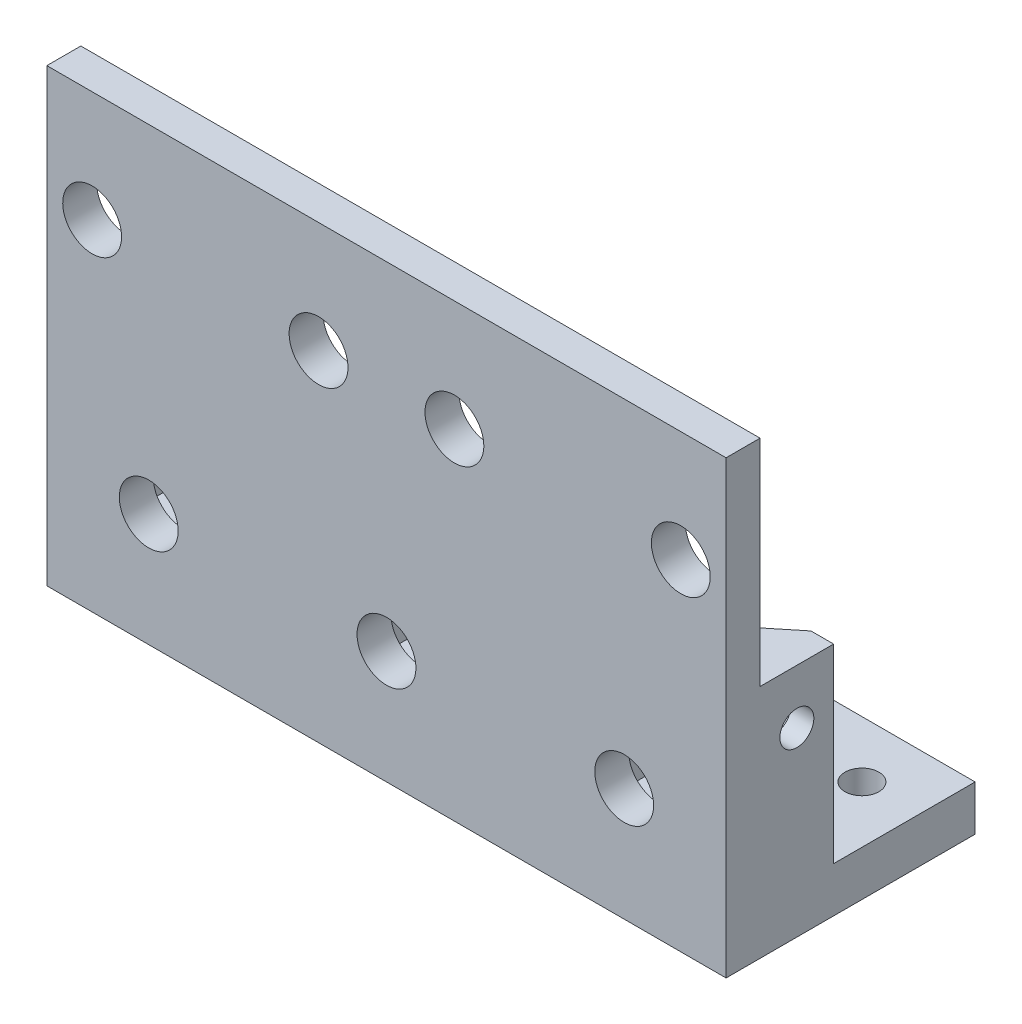
ISO-10303-21;
HEADER;
FILE_DESCRIPTION(('STEP AP214'),'2;1');
FILE_NAME('part.step','',(''),(''),'','','');
FILE_SCHEMA(('AUTOMOTIVE_DESIGN { 1 0 10303 214 1 1 1 1 }'));
ENDSEC;
DATA;
#1=APPLICATION_CONTEXT('core data for automotive mechanical design processes');
#2=APPLICATION_PROTOCOL_DEFINITION('international standard','automotive_design',2000,#1);
#3=PRODUCT_CONTEXT('',#1,'mechanical');
#4=PRODUCT('Part','Part','',(#3));
#5=PRODUCT_RELATED_PRODUCT_CATEGORY('part','',(#4));
#6=PRODUCT_DEFINITION_FORMATION('','',#4);
#7=PRODUCT_DEFINITION_CONTEXT('part definition',#1,'design');
#8=PRODUCT_DEFINITION('design','',#6,#7);
#9=PRODUCT_DEFINITION_SHAPE('','',#8);
#10=(LENGTH_UNIT() NAMED_UNIT(*) SI_UNIT(.MILLI.,.METRE.));
#11=(NAMED_UNIT(*) PLANE_ANGLE_UNIT() SI_UNIT($,.RADIAN.));
#12=(NAMED_UNIT(*) SI_UNIT($,.STERADIAN.) SOLID_ANGLE_UNIT());
#13=UNCERTAINTY_MEASURE_WITH_UNIT(LENGTH_MEASURE(1.E-05),#10,'distance_accuracy_value','');
#14=(GEOMETRIC_REPRESENTATION_CONTEXT(3) GLOBAL_UNCERTAINTY_ASSIGNED_CONTEXT((#13)) GLOBAL_UNIT_ASSIGNED_CONTEXT((#10,
#11,#12)) REPRESENTATION_CONTEXT('',''));
#15=CARTESIAN_POINT('',(0.,0.,0.));
#16=DIRECTION('',(0.,0.,1.));
#17=DIRECTION('',(1.,0.,0.));
#18=AXIS2_PLACEMENT_3D('',#15,#16,#17);
#19=CARTESIAN_POINT('',(60.,19.9,-1.5));
#20=DIRECTION('',(0.,0.,1.));
#21=DIRECTION('',(0.,-1.,0.));
#22=AXIS2_PLACEMENT_3D('',#19,#20,#21);
#23=PLANE('',#22);
#24=CARTESIAN_POINT('',(9.,-9.89999999999999,-1.5));
#25=DIRECTION('',(0.,0.,-1.));
#26=DIRECTION('',(0.,1.,0.));
#27=AXIS2_PLACEMENT_3D('',#24,#25,#26);
#28=CIRCLE('',#27,2.60000000000001);
#29=CARTESIAN_POINT('',(9.,-7.29999999999998,-1.5));
#30=VERTEX_POINT('',#29);
#31=EDGE_CURVE('E335',#30,#30,#28,.T.);
#32=ORIENTED_EDGE('',*,*,#31,.F.);
#33=EDGE_LOOP('',(#32));
#34=FACE_BOUND('',#33,.T.);
#35=CARTESIAN_POINT('',(30.,-9.89999999999999,-1.5));
#36=DIRECTION('',(0.,0.,-1.));
#37=DIRECTION('',(0.,1.,0.));
#38=AXIS2_PLACEMENT_3D('',#35,#36,#37);
#39=CIRCLE('',#38,2.60000000000001);
#40=CARTESIAN_POINT('',(30.,-7.29999999999998,-1.5));
#41=VERTEX_POINT('',#40);
#42=EDGE_CURVE('E329',#41,#41,#39,.T.);
#43=ORIENTED_EDGE('',*,*,#42,.F.);
#44=EDGE_LOOP('',(#43));
#45=FACE_BOUND('',#44,.T.);
#46=CARTESIAN_POINT('',(51.,-9.89999999999999,-1.5));
#47=DIRECTION('',(0.,0.,-1.));
#48=DIRECTION('',(0.,1.,0.));
#49=AXIS2_PLACEMENT_3D('',#46,#47,#48);
#50=CIRCLE('',#49,2.60000000000001);
#51=CARTESIAN_POINT('',(51.,-7.29999999999998,-1.5));
#52=VERTEX_POINT('',#51);
#53=EDGE_CURVE('E323',#52,#52,#50,.T.);
#54=ORIENTED_EDGE('',*,*,#53,.F.);
#55=EDGE_LOOP('',(#54));
#56=FACE_BOUND('',#55,.T.);
#57=CARTESIAN_POINT('',(4.,10.1,-1.5));
#58=DIRECTION('',(0.,0.,-1.));
#59=DIRECTION('',(0.,1.,0.));
#60=AXIS2_PLACEMENT_3D('',#57,#58,#59);
#61=CIRCLE('',#60,2.60000000000001);
#62=CARTESIAN_POINT('',(4.,12.7,-1.5));
#63=VERTEX_POINT('',#62);
#64=EDGE_CURVE('E255',#63,#63,#61,.T.);
#65=ORIENTED_EDGE('',*,*,#64,.F.);
#66=EDGE_LOOP('',(#65));
#67=FACE_BOUND('',#66,.T.);
#68=CARTESIAN_POINT('',(24.,10.1,-1.5));
#69=DIRECTION('',(0.,0.,-1.));
#70=DIRECTION('',(0.,1.,0.));
#71=AXIS2_PLACEMENT_3D('',#68,#69,#70);
#72=CIRCLE('',#71,2.60000000000001);
#73=CARTESIAN_POINT('',(24.,12.7,-1.5));
#74=VERTEX_POINT('',#73);
#75=EDGE_CURVE('E249',#74,#74,#72,.T.);
#76=ORIENTED_EDGE('',*,*,#75,.F.);
#77=EDGE_LOOP('',(#76));
#78=FACE_BOUND('',#77,.T.);
#79=CARTESIAN_POINT('',(36.,10.1,-1.5));
#80=DIRECTION('',(0.,0.,-1.));
#81=DIRECTION('',(0.,1.,0.));
#82=AXIS2_PLACEMENT_3D('',#79,#80,#81);
#83=CIRCLE('',#82,2.60000000000001);
#84=CARTESIAN_POINT('',(36.,12.7,-1.5));
#85=VERTEX_POINT('',#84);
#86=EDGE_CURVE('E243',#85,#85,#83,.T.);
#87=ORIENTED_EDGE('',*,*,#86,.F.);
#88=EDGE_LOOP('',(#87));
#89=FACE_BOUND('',#88,.T.);
#90=CARTESIAN_POINT('',(56.,10.1,-1.5));
#91=DIRECTION('',(0.,0.,-1.));
#92=DIRECTION('',(0.,1.,0.));
#93=AXIS2_PLACEMENT_3D('',#90,#91,#92);
#94=CIRCLE('',#93,2.60000000000001);
#95=CARTESIAN_POINT('',(56.,12.7,-1.5));
#96=VERTEX_POINT('',#95);
#97=EDGE_CURVE('E237',#96,#96,#94,.T.);
#98=ORIENTED_EDGE('',*,*,#97,.F.);
#99=EDGE_LOOP('',(#98));
#100=FACE_BOUND('',#99,.T.);
#101=DIRECTION('',(0.,1.,0.));
#102=VECTOR('',#101,1.);
#103=CARTESIAN_POINT('',(60.,19.9,-1.5));
#104=LINE('',#103,#102);
#105=CARTESIAN_POINT('',(60.,0.900000000000005,-1.5));
#106=VERTEX_POINT('',#105);
#107=CARTESIAN_POINT('',(60.,19.9,-1.5));
#108=VERTEX_POINT('',#107);
#109=EDGE_CURVE('E397',#106,#108,#104,.T.);
#110=ORIENTED_EDGE('',*,*,#109,.F.);
#111=DIRECTION('',(-1.,0.,0.));
#112=VECTOR('',#111,1.);
#113=CARTESIAN_POINT('',(50.,0.900000000000005,-1.49999999999999));
#114=LINE('',#113,#112);
#115=CARTESIAN_POINT('',(50.,0.900000000000005,-1.49999999999999));
#116=VERTEX_POINT('',#115);
#117=EDGE_CURVE('E202',#106,#116,#114,.T.);
#118=ORIENTED_EDGE('',*,*,#117,.T.);
#119=DIRECTION('',(0.,-1.,0.));
#120=VECTOR('',#119,1.);
#121=CARTESIAN_POINT('',(50.,0.900000000000005,-1.49999999999999));
#122=LINE('',#121,#120);
#123=CARTESIAN_POINT('',(50.,-0.899999999999995,-1.49999999999999));
#124=VERTEX_POINT('',#123);
#125=EDGE_CURVE('E213',#116,#124,#122,.T.);
#126=ORIENTED_EDGE('',*,*,#125,.T.);
#127=DIRECTION('',(-1.,0.,0.));
#128=VECTOR('',#127,1.);
#129=CARTESIAN_POINT('',(60.,-0.899999999999995,-1.5));
#130=LINE('',#129,#128);
#131=CARTESIAN_POINT('',(58.,-0.899999999999995,-1.5));
#132=VERTEX_POINT('',#131);
#133=EDGE_CURVE('E203',#132,#124,#130,.T.);
#134=ORIENTED_EDGE('',*,*,#133,.F.);
#135=DIRECTION('',(0.,1.,0.));
#136=VECTOR('',#135,1.);
#137=CARTESIAN_POINT('',(58.,-0.899999999999994,-1.5));
#138=LINE('',#137,#136);
#139=CARTESIAN_POINT('',(58.,-15.9,-1.5));
#140=VERTEX_POINT('',#139);
#141=EDGE_CURVE('E54',#140,#132,#138,.T.);
#142=ORIENTED_EDGE('',*,*,#141,.F.);
#143=DIRECTION('',(-1.,0.,0.));
#144=VECTOR('',#143,1.);
#145=CARTESIAN_POINT('',(60.,-15.9,-1.5));
#146=LINE('',#145,#144);
#147=CARTESIAN_POINT('',(45.,-15.9,-1.5));
#148=VERTEX_POINT('',#147);
#149=EDGE_CURVE('E343',#140,#148,#146,.T.);
#150=ORIENTED_EDGE('',*,*,#149,.T.);
#151=DIRECTION('',(0.,-1.,0.));
#152=VECTOR('',#151,1.);
#153=CARTESIAN_POINT('',(45.,44.1,-1.5));
#154=LINE('',#153,#152);
#155=CARTESIAN_POINT('',(45.,-0.100000000000003,-1.5));
#156=VERTEX_POINT('',#155);
#157=EDGE_CURVE('E348',#156,#148,#154,.T.);
#158=ORIENTED_EDGE('',*,*,#157,.F.);
#159=DIRECTION('',(-1.,0.,0.));
#160=VECTOR('',#159,1.);
#161=CARTESIAN_POINT('',(60.,-0.100000000000003,-1.5));
#162=LINE('',#161,#160);
#163=CARTESIAN_POINT('',(36.,-0.100000000000003,-1.5));
#164=VERTEX_POINT('',#163);
#165=EDGE_CURVE('E424',#156,#164,#162,.T.);
#166=ORIENTED_EDGE('',*,*,#165,.T.);
#167=DIRECTION('',(0.,-1.,0.));
#168=VECTOR('',#167,1.);
#169=CARTESIAN_POINT('',(36.,44.1,-1.5));
#170=LINE('',#169,#168);
#171=CARTESIAN_POINT('',(36.,-15.9,-1.5));
#172=VERTEX_POINT('',#171);
#173=EDGE_CURVE('E365',#164,#172,#170,.T.);
#174=ORIENTED_EDGE('',*,*,#173,.T.);
#175=DIRECTION('',(-1.,0.,0.));
#176=VECTOR('',#175,1.);
#177=CARTESIAN_POINT('',(36.,-15.9,-1.5));
#178=LINE('',#177,#176);
#179=CARTESIAN_POINT('',(24.,-15.9,-1.5));
#180=VERTEX_POINT('',#179);
#181=EDGE_CURVE('E367',#172,#180,#178,.T.);
#182=ORIENTED_EDGE('',*,*,#181,.T.);
#183=DIRECTION('',(0.,-1.,0.));
#184=VECTOR('',#183,1.);
#185=CARTESIAN_POINT('',(24.,44.1,-1.5));
#186=LINE('',#185,#184);
#187=CARTESIAN_POINT('',(24.,-0.100000000000003,-1.5));
#188=VERTEX_POINT('',#187);
#189=EDGE_CURVE('E341',#188,#180,#186,.T.);
#190=ORIENTED_EDGE('',*,*,#189,.F.);
#191=CARTESIAN_POINT('',(15.,-0.100000000000003,-1.5));
#192=VERTEX_POINT('',#191);
#193=EDGE_CURVE('E422',#188,#192,#162,.T.);
#194=ORIENTED_EDGE('',*,*,#193,.T.);
#195=DIRECTION('',(0.,-1.,0.));
#196=VECTOR('',#195,1.);
#197=CARTESIAN_POINT('',(15.,44.1,-1.5));
#198=LINE('',#197,#196);
#199=CARTESIAN_POINT('',(15.,-15.9,-1.5));
#200=VERTEX_POINT('',#199);
#201=EDGE_CURVE('E352',#192,#200,#198,.T.);
#202=ORIENTED_EDGE('',*,*,#201,.T.);
#203=DIRECTION('',(-1.,0.,0.));
#204=VECTOR('',#203,1.);
#205=CARTESIAN_POINT('',(0.,-15.9,-1.5));
#206=LINE('',#205,#204);
#207=CARTESIAN_POINT('',(2.,-15.9,-1.5));
#208=VERTEX_POINT('',#207);
#209=EDGE_CURVE('E354',#200,#208,#206,.T.);
#210=ORIENTED_EDGE('',*,*,#209,.T.);
#211=DIRECTION('',(0.,1.,0.));
#212=VECTOR('',#211,1.);
#213=CARTESIAN_POINT('',(2.,-0.899999999999994,-1.5));
#214=LINE('',#213,#212);
#215=CARTESIAN_POINT('',(2.,-0.899999999999994,-1.5));
#216=VERTEX_POINT('',#215);
#217=EDGE_CURVE('E290',#208,#216,#214,.T.);
#218=ORIENTED_EDGE('',*,*,#217,.T.);
#219=DIRECTION('',(1.,0.,0.));
#220=VECTOR('',#219,1.);
#221=CARTESIAN_POINT('',(10.,-0.899999999999995,-1.49999999999999));
#222=LINE('',#221,#220);
#223=CARTESIAN_POINT('',(9.99999999999998,-0.899999999999995,-1.5));
#224=VERTEX_POINT('',#223);
#225=EDGE_CURVE('E261',#216,#224,#222,.T.);
#226=ORIENTED_EDGE('',*,*,#225,.T.);
#227=DIRECTION('',(0.,-1.,0.));
#228=VECTOR('',#227,1.);
#229=CARTESIAN_POINT('',(10.,0.900000000000005,-1.49999999999999));
#230=LINE('',#229,#228);
#231=CARTESIAN_POINT('',(9.99999999999998,0.900000000000005,-1.5));
#232=VERTEX_POINT('',#231);
#233=EDGE_CURVE('E280',#232,#224,#230,.T.);
#234=ORIENTED_EDGE('',*,*,#233,.F.);
#235=DIRECTION('',(1.,0.,0.));
#236=VECTOR('',#235,1.);
#237=CARTESIAN_POINT('',(0.,0.900000000000005,-1.5));
#238=LINE('',#237,#236);
#239=CARTESIAN_POINT('',(0.,0.900000000000005,-1.5));
#240=VERTEX_POINT('',#239);
#241=EDGE_CURVE('E265',#240,#232,#238,.T.);
#242=ORIENTED_EDGE('',*,*,#241,.F.);
#243=DIRECTION('',(0.,1.,0.));
#244=VECTOR('',#243,1.);
#245=CARTESIAN_POINT('',(0.,19.9,-1.5));
#246=LINE('',#245,#244);
#247=CARTESIAN_POINT('',(0.,19.9,-1.5));
#248=VERTEX_POINT('',#247);
#249=EDGE_CURVE('E407',#240,#248,#246,.T.);
#250=ORIENTED_EDGE('',*,*,#249,.T.);
#251=DIRECTION('',(-1.,0.,0.));
#252=VECTOR('',#251,1.);
#253=CARTESIAN_POINT('',(60.,19.9,-1.5));
#254=LINE('',#253,#252);
#255=EDGE_CURVE('E419',#108,#248,#254,.T.);
#256=ORIENTED_EDGE('',*,*,#255,.F.);
#257=EDGE_LOOP('',(#110,#118,#126,#134,#142,#150,#158,#166,#174,#182,#190,#194,#202,#210,#218,
#226,#234,#242,#250,#256));
#258=FACE_BOUND('',#257,.T.);
#259=ADVANCED_FACE('F39',(#34,#45,#56,#67,#78,#89,#100,#258),#23,.F.);
#260=CARTESIAN_POINT('',(0.,-15.9,0.));
#261=DIRECTION('',(0.,-1.,0.));
#262=DIRECTION('',(0.,0.,-1.));
#263=AXIS2_PLACEMENT_3D('',#260,#261,#262);
#264=PLANE('',#263);
#265=CARTESIAN_POINT('',(55.,-15.9,-15.5));
#266=DIRECTION('',(0.,-1.,0.));
#267=DIRECTION('',(0.,0.,-1.));
#268=AXIS2_PLACEMENT_3D('',#265,#266,#267);
#269=CIRCLE('',#268,1.50000000000001);
#270=CARTESIAN_POINT('',(55.,-15.9,-17.));
#271=VERTEX_POINT('',#270);
#272=EDGE_CURVE('E308',#271,#271,#269,.T.);
#273=ORIENTED_EDGE('',*,*,#272,.T.);
#274=EDGE_LOOP('',(#273));
#275=FACE_BOUND('',#274,.T.);
#276=DIRECTION('',(0.,0.,1.));
#277=VECTOR('',#276,1.);
#278=CARTESIAN_POINT('',(58.,-15.9,-8.));
#279=LINE('',#278,#277);
#280=CARTESIAN_POINT('',(58.,-15.9,-8.));
#281=VERTEX_POINT('',#280);
#282=EDGE_CURVE('E227',#281,#140,#279,.T.);
#283=ORIENTED_EDGE('',*,*,#282,.F.);
#284=DIRECTION('',(1.,0.,0.));
#285=VECTOR('',#284,1.);
#286=CARTESIAN_POINT('',(58.,-15.9,-8.));
#287=LINE('',#286,#285);
#288=CARTESIAN_POINT('',(60.,-15.9,-8.));
#289=VERTEX_POINT('',#288);
#290=EDGE_CURVE('E62',#281,#289,#287,.T.);
#291=ORIENTED_EDGE('',*,*,#290,.T.);
#292=DIRECTION('',(0.,0.,1.));
#293=VECTOR('',#292,1.);
#294=CARTESIAN_POINT('',(60.,-15.9,-20.5));
#295=LINE('',#294,#293);
#296=CARTESIAN_POINT('',(60.,-15.9,-20.5));
#297=VERTEX_POINT('',#296);
#298=EDGE_CURVE('E190',#297,#289,#295,.T.);
#299=ORIENTED_EDGE('',*,*,#298,.F.);
#300=DIRECTION('',(-1.,0.,0.));
#301=VECTOR('',#300,1.);
#302=CARTESIAN_POINT('',(60.,-15.9,-20.5));
#303=LINE('',#302,#301);
#304=CARTESIAN_POINT('',(45.,-15.9,-20.5));
#305=VERTEX_POINT('',#304);
#306=EDGE_CURVE('E47',#297,#305,#303,.T.);
#307=ORIENTED_EDGE('',*,*,#306,.T.);
#308=DIRECTION('',(0.,0.,-1.));
#309=VECTOR('',#308,1.);
#310=CARTESIAN_POINT('',(45.,-15.9,-20.5));
#311=LINE('',#310,#309);
#312=EDGE_CURVE('E346',#148,#305,#311,.T.);
#313=ORIENTED_EDGE('',*,*,#312,.F.);
#314=ORIENTED_EDGE('',*,*,#149,.F.);
#315=EDGE_LOOP('',(#283,#291,#299,#307,#313,#314));
#316=FACE_BOUND('',#315,.T.);
#317=ADVANCED_FACE('F501',(#275,#316),#264,.F.);
#318=CARTESIAN_POINT('',(60.,-15.9,-20.5));
#319=DIRECTION('',(0.,-0.768884270285603,0.639387972132238));
#320=DIRECTION('',(0.,-0.639387972132238,-0.768884270285603));
#321=AXIS2_PLACEMENT_3D('',#318,#319,#320);
#322=PLANE('',#321);
#323=CARTESIAN_POINT('',(24.,-15.9,-20.5));
#324=VERTEX_POINT('',#323);
#325=CARTESIAN_POINT('',(15.,-15.9,-20.5));
#326=VERTEX_POINT('',#325);
#327=EDGE_CURVE('E427',#324,#326,#303,.T.);
#328=ORIENTED_EDGE('',*,*,#327,.T.);
#329=DIRECTION('',(0.,0.639387972132238,0.768884270285603));
#330=VECTOR('',#329,1.);
#331=CARTESIAN_POINT('',(15.,-15.9,-20.5));
#332=LINE('',#331,#330);
#333=EDGE_CURVE('E384',#326,#192,#332,.T.);
#334=ORIENTED_EDGE('',*,*,#333,.T.);
#335=ORIENTED_EDGE('',*,*,#193,.F.);
#336=DIRECTION('',(0.,-0.639387972132238,-0.768884270285603));
#337=VECTOR('',#336,1.);
#338=CARTESIAN_POINT('',(24.,-15.9,-20.5));
#339=LINE('',#338,#337);
#340=EDGE_CURVE('E381',#188,#324,#339,.T.);
#341=ORIENTED_EDGE('',*,*,#340,.T.);
#342=EDGE_LOOP('',(#328,#334,#335,#341));
#343=FACE_BOUND('',#342,.T.);
#344=ADVANCED_FACE('F452',(#343),#322,.F.);
#345=CARTESIAN_POINT('',(60.,-19.9,-20.5));
#346=DIRECTION('',(0.,0.,1.));
#347=DIRECTION('',(1.,0.,0.));
#348=AXIS2_PLACEMENT_3D('',#345,#346,#347);
#349=PLANE('',#348);
#350=DIRECTION('',(0.,1.,0.));
#351=VECTOR('',#350,1.);
#352=CARTESIAN_POINT('',(0.,-19.9,-20.5));
#353=LINE('',#352,#351);
#354=CARTESIAN_POINT('',(0.,-19.9,-20.5));
#355=VERTEX_POINT('',#354);
#356=CARTESIAN_POINT('',(0.,-15.9,-20.5));
#357=VERTEX_POINT('',#356);
#358=EDGE_CURVE('E390',#355,#357,#353,.T.);
#359=ORIENTED_EDGE('',*,*,#358,.T.);
#360=DIRECTION('',(1.,0.,0.));
#361=VECTOR('',#360,1.);
#362=CARTESIAN_POINT('',(0.,-15.9,-20.5));
#363=LINE('',#362,#361);
#364=EDGE_CURVE('E361',#357,#326,#363,.T.);
#365=ORIENTED_EDGE('',*,*,#364,.T.);
#366=ORIENTED_EDGE('',*,*,#327,.F.);
#367=DIRECTION('',(1.,0.,0.));
#368=VECTOR('',#367,1.);
#369=CARTESIAN_POINT('',(36.,-15.9,-20.5));
#370=LINE('',#369,#368);
#371=CARTESIAN_POINT('',(36.,-15.9,-20.5));
#372=VERTEX_POINT('',#371);
#373=EDGE_CURVE('E374',#324,#372,#370,.T.);
#374=ORIENTED_EDGE('',*,*,#373,.T.);
#375=EDGE_CURVE('E426',#305,#372,#303,.T.);
#376=ORIENTED_EDGE('',*,*,#375,.F.);
#377=ORIENTED_EDGE('',*,*,#306,.F.);
#378=DIRECTION('',(0.,1.,0.));
#379=VECTOR('',#378,1.);
#380=CARTESIAN_POINT('',(60.,-19.9,-20.5));
#381=LINE('',#380,#379);
#382=CARTESIAN_POINT('',(60.,-19.9,-20.5));
#383=VERTEX_POINT('',#382);
#384=EDGE_CURVE('E394',#383,#297,#381,.T.);
#385=ORIENTED_EDGE('',*,*,#384,.F.);
#386=DIRECTION('',(-1.,0.,0.));
#387=VECTOR('',#386,1.);
#388=CARTESIAN_POINT('',(60.,-19.9,-20.5));
#389=LINE('',#388,#387);
#390=EDGE_CURVE('E11',#383,#355,#389,.T.);
#391=ORIENTED_EDGE('',*,*,#390,.T.);
#392=EDGE_LOOP('',(#359,#365,#366,#374,#376,#377,#385,#391));
#393=FACE_BOUND('',#392,.T.);
#394=ADVANCED_FACE('F41',(#393),#349,.F.);
#395=ORIENTED_EDGE('',*,*,#165,.F.);
#396=DIRECTION('',(0.,-0.639387972132238,-0.768884270285603));
#397=VECTOR('',#396,1.);
#398=CARTESIAN_POINT('',(45.,-15.9,-20.5));
#399=LINE('',#398,#397);
#400=EDGE_CURVE('E387',#156,#305,#399,.T.);
#401=ORIENTED_EDGE('',*,*,#400,.T.);
#402=ORIENTED_EDGE('',*,*,#375,.T.);
#403=DIRECTION('',(0.,0.639387972132238,0.768884270285603));
#404=VECTOR('',#403,1.);
#405=CARTESIAN_POINT('',(36.,-15.9,-20.5));
#406=LINE('',#405,#404);
#407=EDGE_CURVE('E351',#372,#164,#406,.T.);
#408=ORIENTED_EDGE('',*,*,#407,.T.);
#409=EDGE_LOOP('',(#395,#401,#402,#408));
#410=FACE_BOUND('',#409,.T.);
#411=ADVANCED_FACE('F438',(#410),#322,.F.);
#412=CARTESIAN_POINT('',(60.,19.9,1.5));
#413=DIRECTION('',(0.,-1.,0.));
#414=DIRECTION('',(0.,0.,-1.));
#415=AXIS2_PLACEMENT_3D('',#412,#413,#414);
#416=PLANE('',#415);
#417=DIRECTION('',(0.,0.,1.));
#418=VECTOR('',#417,1.);
#419=CARTESIAN_POINT('',(0.,19.9,1.5));
#420=LINE('',#419,#418);
#421=CARTESIAN_POINT('',(0.,19.9,1.5));
#422=VERTEX_POINT('',#421);
#423=EDGE_CURVE('E409',#248,#422,#420,.T.);
#424=ORIENTED_EDGE('',*,*,#423,.T.);
#425=DIRECTION('',(-1.,0.,0.));
#426=VECTOR('',#425,1.);
#427=CARTESIAN_POINT('',(60.,19.9,1.5));
#428=LINE('',#427,#426);
#429=CARTESIAN_POINT('',(60.,19.9,1.5));
#430=VERTEX_POINT('',#429);
#431=EDGE_CURVE('E416',#430,#422,#428,.T.);
#432=ORIENTED_EDGE('',*,*,#431,.F.);
#433=DIRECTION('',(0.,0.,1.));
#434=VECTOR('',#433,1.);
#435=CARTESIAN_POINT('',(60.,19.9,1.5));
#436=LINE('',#435,#434);
#437=EDGE_CURVE('E399',#108,#430,#436,.T.);
#438=ORIENTED_EDGE('',*,*,#437,.F.);
#439=ORIENTED_EDGE('',*,*,#255,.T.);
#440=EDGE_LOOP('',(#424,#432,#438,#439));
#441=FACE_BOUND('',#440,.T.);
#442=ADVANCED_FACE('F489',(#441),#416,.F.);
#443=CARTESIAN_POINT('',(60.,19.9,1.5));
#444=DIRECTION('',(0.,0.,-1.));
#445=DIRECTION('',(0.,1.,0.));
#446=AXIS2_PLACEMENT_3D('',#443,#444,#445);
#447=PLANE('',#446);
#448=CARTESIAN_POINT('',(56.,10.1,1.5));
#449=DIRECTION('',(0.,0.,-1.));
#450=DIRECTION('',(0.,1.,0.));
#451=AXIS2_PLACEMENT_3D('',#448,#449,#450);
#452=CIRCLE('',#451,2.60000000000001);
#453=CARTESIAN_POINT('',(56.,12.7,1.5));
#454=VERTEX_POINT('',#453);
#455=EDGE_CURVE('E240',#454,#454,#452,.T.);
#456=ORIENTED_EDGE('',*,*,#455,.T.);
#457=EDGE_LOOP('',(#456));
#458=FACE_BOUND('',#457,.T.);
#459=CARTESIAN_POINT('',(36.,10.1,1.5));
#460=DIRECTION('',(0.,0.,-1.));
#461=DIRECTION('',(0.,1.,0.));
#462=AXIS2_PLACEMENT_3D('',#459,#460,#461);
#463=CIRCLE('',#462,2.60000000000001);
#464=CARTESIAN_POINT('',(36.,12.7,1.5));
#465=VERTEX_POINT('',#464);
#466=EDGE_CURVE('E246',#465,#465,#463,.T.);
#467=ORIENTED_EDGE('',*,*,#466,.T.);
#468=EDGE_LOOP('',(#467));
#469=FACE_BOUND('',#468,.T.);
#470=CARTESIAN_POINT('',(24.,10.1,1.5));
#471=DIRECTION('',(0.,0.,-1.));
#472=DIRECTION('',(0.,1.,0.));
#473=AXIS2_PLACEMENT_3D('',#470,#471,#472);
#474=CIRCLE('',#473,2.60000000000001);
#475=CARTESIAN_POINT('',(24.,12.7,1.5));
#476=VERTEX_POINT('',#475);
#477=EDGE_CURVE('E252',#476,#476,#474,.T.);
#478=ORIENTED_EDGE('',*,*,#477,.T.);
#479=EDGE_LOOP('',(#478));
#480=FACE_BOUND('',#479,.T.);
#481=CARTESIAN_POINT('',(4.,10.1,1.5));
#482=DIRECTION('',(0.,0.,-1.));
#483=DIRECTION('',(0.,1.,0.));
#484=AXIS2_PLACEMENT_3D('',#481,#482,#483);
#485=CIRCLE('',#484,2.60000000000001);
#486=CARTESIAN_POINT('',(4.,12.7,1.5));
#487=VERTEX_POINT('',#486);
#488=EDGE_CURVE('E258',#487,#487,#485,.T.);
#489=ORIENTED_EDGE('',*,*,#488,.T.);
#490=EDGE_LOOP('',(#489));
#491=FACE_BOUND('',#490,.T.);
#492=CARTESIAN_POINT('',(51.,-9.89999999999999,1.5));
#493=DIRECTION('',(0.,0.,-1.));
#494=DIRECTION('',(0.,1.,0.));
#495=AXIS2_PLACEMENT_3D('',#492,#493,#494);
#496=CIRCLE('',#495,2.60000000000001);
#497=CARTESIAN_POINT('',(51.,-7.29999999999998,1.5));
#498=VERTEX_POINT('',#497);
#499=EDGE_CURVE('E326',#498,#498,#496,.T.);
#500=ORIENTED_EDGE('',*,*,#499,.T.);
#501=EDGE_LOOP('',(#500));
#502=FACE_BOUND('',#501,.T.);
#503=CARTESIAN_POINT('',(30.,-9.89999999999999,1.5));
#504=DIRECTION('',(0.,0.,-1.));
#505=DIRECTION('',(0.,1.,0.));
#506=AXIS2_PLACEMENT_3D('',#503,#504,#505);
#507=CIRCLE('',#506,2.60000000000001);
#508=CARTESIAN_POINT('',(30.,-7.29999999999998,1.5));
#509=VERTEX_POINT('',#508);
#510=EDGE_CURVE('E332',#509,#509,#507,.T.);
#511=ORIENTED_EDGE('',*,*,#510,.T.);
#512=EDGE_LOOP('',(#511));
#513=FACE_BOUND('',#512,.T.);
#514=CARTESIAN_POINT('',(9.,-9.89999999999999,1.5));
#515=DIRECTION('',(0.,0.,-1.));
#516=DIRECTION('',(0.,1.,0.));
#517=AXIS2_PLACEMENT_3D('',#514,#515,#516);
#518=CIRCLE('',#517,2.60000000000001);
#519=CARTESIAN_POINT('',(9.,-7.29999999999998,1.5));
#520=VERTEX_POINT('',#519);
#521=EDGE_CURVE('E338',#520,#520,#518,.T.);
#522=ORIENTED_EDGE('',*,*,#521,.T.);
#523=EDGE_LOOP('',(#522));
#524=FACE_BOUND('',#523,.T.);
#525=DIRECTION('',(0.,-1.,0.));
#526=VECTOR('',#525,1.);
#527=CARTESIAN_POINT('',(0.,19.9,1.5));
#528=LINE('',#527,#526);
#529=CARTESIAN_POINT('',(0.,-19.9,1.5));
#530=VERTEX_POINT('',#529);
#531=EDGE_CURVE('E411',#422,#530,#528,.T.);
#532=ORIENTED_EDGE('',*,*,#531,.T.);
#533=DIRECTION('',(-1.,0.,0.));
#534=VECTOR('',#533,1.);
#535=CARTESIAN_POINT('',(60.,-19.9,1.5));
#536=LINE('',#535,#534);
#537=CARTESIAN_POINT('',(60.,-19.9,1.5));
#538=VERTEX_POINT('',#537);
#539=EDGE_CURVE('E404',#538,#530,#536,.T.);
#540=ORIENTED_EDGE('',*,*,#539,.F.);
#541=DIRECTION('',(0.,-1.,0.));
#542=VECTOR('',#541,1.);
#543=CARTESIAN_POINT('',(60.,19.9,1.5));
#544=LINE('',#543,#542);
#545=EDGE_CURVE('E401',#430,#538,#544,.T.);
#546=ORIENTED_EDGE('',*,*,#545,.F.);
#547=ORIENTED_EDGE('',*,*,#431,.T.);
#548=EDGE_LOOP('',(#532,#540,#546,#547));
#549=FACE_BOUND('',#548,.T.);
#550=ADVANCED_FACE('F530',(#458,#469,#480,#491,#502,#513,#524,#549),#447,.F.);
#551=CARTESIAN_POINT('',(60.,-19.9,1.5));
#552=DIRECTION('',(0.,1.,0.));
#553=DIRECTION('',(0.,0.,1.));
#554=AXIS2_PLACEMENT_3D('',#551,#552,#553);
#555=PLANE('',#554);
#556=CARTESIAN_POINT('',(55.,-19.9,-15.5));
#557=DIRECTION('',(0.,-1.,0.));
#558=DIRECTION('',(0.,0.,-1.));
#559=AXIS2_PLACEMENT_3D('',#556,#557,#558);
#560=CIRCLE('',#559,1.50000000000002);
#561=CARTESIAN_POINT('',(55.,-19.9,-17.));
#562=VERTEX_POINT('',#561);
#563=EDGE_CURVE('E305',#562,#562,#560,.T.);
#564=ORIENTED_EDGE('',*,*,#563,.F.);
#565=EDGE_LOOP('',(#564));
#566=FACE_BOUND('',#565,.T.);
#567=CARTESIAN_POINT('',(30.,-19.9,-15.5));
#568=DIRECTION('',(0.,-1.,0.));
#569=DIRECTION('',(0.,0.,-1.));
#570=AXIS2_PLACEMENT_3D('',#567,#568,#569);
#571=CIRCLE('',#570,1.50000000000002);
#572=CARTESIAN_POINT('',(30.,-19.9,-17.));
#573=VERTEX_POINT('',#572);
#574=EDGE_CURVE('E311',#573,#573,#571,.T.);
#575=ORIENTED_EDGE('',*,*,#574,.F.);
#576=EDGE_LOOP('',(#575));
#577=FACE_BOUND('',#576,.T.);
#578=CARTESIAN_POINT('',(5.,-19.9,-15.5));
#579=DIRECTION('',(0.,-1.,0.));
#580=DIRECTION('',(0.,0.,-1.));
#581=AXIS2_PLACEMENT_3D('',#578,#579,#580);
#582=CIRCLE('',#581,1.50000000000001);
#583=CARTESIAN_POINT('',(5.,-19.9,-17.));
#584=VERTEX_POINT('',#583);
#585=EDGE_CURVE('E317',#584,#584,#582,.T.);
#586=ORIENTED_EDGE('',*,*,#585,.F.);
#587=EDGE_LOOP('',(#586));
#588=FACE_BOUND('',#587,.T.);
#589=DIRECTION('',(0.,0.,-1.));
#590=VECTOR('',#589,1.);
#591=CARTESIAN_POINT('',(0.,-19.9,1.5));
#592=LINE('',#591,#590);
#593=EDGE_CURVE('E395',#530,#355,#592,.T.);
#594=ORIENTED_EDGE('',*,*,#593,.T.);
#595=ORIENTED_EDGE('',*,*,#390,.F.);
#596=DIRECTION('',(0.,0.,-1.));
#597=VECTOR('',#596,1.);
#598=CARTESIAN_POINT('',(60.,-19.9,-1.5));
#599=LINE('',#598,#597);
#600=EDGE_CURVE('E391',#538,#383,#599,.T.);
#601=ORIENTED_EDGE('',*,*,#600,.F.);
#602=ORIENTED_EDGE('',*,*,#539,.T.);
#603=EDGE_LOOP('',(#594,#595,#601,#602));
#604=FACE_BOUND('',#603,.T.);
#605=ADVANCED_FACE('F630',(#566,#577,#588,#604),#555,.F.);
#606=CARTESIAN_POINT('',(60.,0.,0.));
#607=DIRECTION('',(1.,0.,0.));
#608=DIRECTION('',(0.,0.,-1.));
#609=AXIS2_PLACEMENT_3D('',#606,#607,#608);
#610=PLANE('',#609);
#611=DIRECTION('',(0.,0.,1.));
#612=VECTOR('',#611,1.);
#613=CARTESIAN_POINT('',(60.,0.900000000000002,-8.));
#614=LINE('',#613,#612);
#615=CARTESIAN_POINT('',(60.,0.900000000000002,-8.));
#616=VERTEX_POINT('',#615);
#617=EDGE_CURVE('E187',#616,#106,#614,.T.);
#618=ORIENTED_EDGE('',*,*,#617,.T.);
#619=ORIENTED_EDGE('',*,*,#109,.T.);
#620=ORIENTED_EDGE('',*,*,#437,.T.);
#621=ORIENTED_EDGE('',*,*,#545,.T.);
#622=ORIENTED_EDGE('',*,*,#600,.T.);
#623=ORIENTED_EDGE('',*,*,#384,.T.);
#624=ORIENTED_EDGE('',*,*,#298,.T.);
#625=DIRECTION('',(0.,-1.,0.));
#626=VECTOR('',#625,1.);
#627=CARTESIAN_POINT('',(60.,-0.899999999999996,-8.));
#628=LINE('',#627,#626);
#629=EDGE_CURVE('E183',#616,#289,#628,.T.);
#630=ORIENTED_EDGE('',*,*,#629,.F.);
#631=EDGE_LOOP('',(#618,#619,#620,#621,#622,#623,#624,#630));
#632=FACE_BOUND('',#631,.T.);
#633=CARTESIAN_POINT('',(60.,-3.9,-4.75));
#634=DIRECTION('',(-1.,0.,0.));
#635=DIRECTION('',(0.,0.,1.));
#636=AXIS2_PLACEMENT_3D('',#633,#634,#635);
#637=CIRCLE('',#636,1.5);
#638=CARTESIAN_POINT('',(60.,-3.9,-3.25));
#639=VERTEX_POINT('',#638);
#640=EDGE_CURVE('E221',#639,#639,#637,.T.);
#641=ORIENTED_EDGE('',*,*,#640,.T.);
#642=EDGE_LOOP('',(#641));
#643=FACE_BOUND('',#642,.T.);
#644=ADVANCED_FACE('F185',(#632,#643),#610,.T.);
#645=CARTESIAN_POINT('',(0.,0.,0.));
#646=DIRECTION('',(1.,0.,0.));
#647=DIRECTION('',(0.,0.,-1.));
#648=AXIS2_PLACEMENT_3D('',#645,#646,#647);
#649=PLANE('',#648);
#650=ORIENTED_EDGE('',*,*,#249,.F.);
#651=DIRECTION('',(0.,0.,1.));
#652=VECTOR('',#651,1.);
#653=CARTESIAN_POINT('',(0.,0.900000000000002,-8.));
#654=LINE('',#653,#652);
#655=CARTESIAN_POINT('',(0.,0.900000000000002,-8.));
#656=VERTEX_POINT('',#655);
#657=EDGE_CURVE('E262',#656,#240,#654,.T.);
#658=ORIENTED_EDGE('',*,*,#657,.F.);
#659=DIRECTION('',(0.,-1.,0.));
#660=VECTOR('',#659,1.);
#661=CARTESIAN_POINT('',(0.,-6.9,-8.));
#662=LINE('',#661,#660);
#663=CARTESIAN_POINT('',(0.,-15.9,-8.));
#664=VERTEX_POINT('',#663);
#665=EDGE_CURVE('E287',#656,#664,#662,.T.);
#666=ORIENTED_EDGE('',*,*,#665,.T.);
#667=DIRECTION('',(0.,0.,-1.));
#668=VECTOR('',#667,1.);
#669=CARTESIAN_POINT('',(0.,-15.9,-20.5));
#670=LINE('',#669,#668);
#671=EDGE_CURVE('E344',#664,#357,#670,.T.);
#672=ORIENTED_EDGE('',*,*,#671,.T.);
#673=ORIENTED_EDGE('',*,*,#358,.F.);
#674=ORIENTED_EDGE('',*,*,#593,.F.);
#675=ORIENTED_EDGE('',*,*,#531,.F.);
#676=ORIENTED_EDGE('',*,*,#423,.F.);
#677=EDGE_LOOP('',(#650,#658,#666,#672,#673,#674,#675,#676));
#678=FACE_BOUND('',#677,.T.);
#679=CARTESIAN_POINT('',(0.,-3.9,-4.75));
#680=DIRECTION('',(-1.,0.,0.));
#681=DIRECTION('',(0.,0.,1.));
#682=AXIS2_PLACEMENT_3D('',#679,#680,#681);
#683=CIRCLE('',#682,1.5);
#684=CARTESIAN_POINT('',(0.,-3.9,-3.25));
#685=VERTEX_POINT('',#684);
#686=EDGE_CURVE('E283',#685,#685,#683,.T.);
#687=ORIENTED_EDGE('',*,*,#686,.F.);
#688=EDGE_LOOP('',(#687));
#689=FACE_BOUND('',#688,.T.);
#690=ADVANCED_FACE('F482',(#678,#689),#649,.F.);
#691=CARTESIAN_POINT('',(15.,44.1,-20.5));
#692=DIRECTION('',(1.,0.,0.));
#693=DIRECTION('',(0.,0.,-1.));
#694=AXIS2_PLACEMENT_3D('',#691,#692,#693);
#695=PLANE('',#694);
#696=DIRECTION('',(0.,0.,1.));
#697=VECTOR('',#696,1.);
#698=CARTESIAN_POINT('',(15.,-15.9,-20.5));
#699=LINE('',#698,#697);
#700=EDGE_CURVE('E358',#326,#200,#699,.T.);
#701=ORIENTED_EDGE('',*,*,#700,.T.);
#702=ORIENTED_EDGE('',*,*,#201,.F.);
#703=ORIENTED_EDGE('',*,*,#333,.F.);
#704=EDGE_LOOP('',(#701,#702,#703));
#705=FACE_BOUND('',#704,.T.);
#706=ADVANCED_FACE('F456',(#705),#695,.F.);
#707=CARTESIAN_POINT('',(0.,-15.9,0.));
#708=DIRECTION('',(0.,1.,0.));
#709=DIRECTION('',(0.,0.,1.));
#710=AXIS2_PLACEMENT_3D('',#707,#708,#709);
#711=PLANE('',#710);
#712=DIRECTION('',(-1.,0.,0.));
#713=VECTOR('',#712,1.);
#714=CARTESIAN_POINT('',(2.,-15.9,-8.));
#715=LINE('',#714,#713);
#716=CARTESIAN_POINT('',(2.,-15.9,-8.));
#717=VERTEX_POINT('',#716);
#718=EDGE_CURVE('E301',#717,#664,#715,.T.);
#719=ORIENTED_EDGE('',*,*,#718,.F.);
#720=DIRECTION('',(0.,0.,1.));
#721=VECTOR('',#720,1.);
#722=CARTESIAN_POINT('',(2.,-15.9,-8.));
#723=LINE('',#722,#721);
#724=EDGE_CURVE('E298',#717,#208,#723,.T.);
#725=ORIENTED_EDGE('',*,*,#724,.T.);
#726=ORIENTED_EDGE('',*,*,#209,.F.);
#727=ORIENTED_EDGE('',*,*,#700,.F.);
#728=ORIENTED_EDGE('',*,*,#364,.F.);
#729=ORIENTED_EDGE('',*,*,#671,.F.);
#730=EDGE_LOOP('',(#719,#725,#726,#727,#728,#729));
#731=FACE_BOUND('',#730,.T.);
#732=CARTESIAN_POINT('',(5.,-15.9,-15.5));
#733=DIRECTION('',(0.,1.,0.));
#734=DIRECTION('',(0.,0.,1.));
#735=AXIS2_PLACEMENT_3D('',#732,#733,#734);
#736=CIRCLE('',#735,1.50000000000001);
#737=CARTESIAN_POINT('',(5.,-15.9,-14.));
#738=VERTEX_POINT('',#737);
#739=EDGE_CURVE('E320',#738,#738,#736,.T.);
#740=ORIENTED_EDGE('',*,*,#739,.F.);
#741=EDGE_LOOP('',(#740));
#742=FACE_BOUND('',#741,.T.);
#743=ADVANCED_FACE('F460',(#731,#742),#711,.T.);
#744=CARTESIAN_POINT('',(45.,44.1,-20.5));
#745=DIRECTION('',(-1.,0.,0.));
#746=DIRECTION('',(0.,0.,1.));
#747=AXIS2_PLACEMENT_3D('',#744,#745,#746);
#748=PLANE('',#747);
#749=ORIENTED_EDGE('',*,*,#157,.T.);
#750=ORIENTED_EDGE('',*,*,#312,.T.);
#751=ORIENTED_EDGE('',*,*,#400,.F.);
#752=EDGE_LOOP('',(#749,#750,#751));
#753=FACE_BOUND('',#752,.T.);
#754=ADVANCED_FACE('F503',(#753),#748,.F.);
#755=CARTESIAN_POINT('',(24.,44.1,-1.5));
#756=DIRECTION('',(-1.,0.,0.));
#757=DIRECTION('',(0.,0.,1.));
#758=AXIS2_PLACEMENT_3D('',#755,#756,#757);
#759=PLANE('',#758);
#760=ORIENTED_EDGE('',*,*,#189,.T.);
#761=DIRECTION('',(0.,0.,-1.));
#762=VECTOR('',#761,1.);
#763=CARTESIAN_POINT('',(24.,-15.9,-1.5));
#764=LINE('',#763,#762);
#765=EDGE_CURVE('E355',#180,#324,#764,.T.);
#766=ORIENTED_EDGE('',*,*,#765,.T.);
#767=ORIENTED_EDGE('',*,*,#340,.F.);
#768=EDGE_LOOP('',(#760,#766,#767));
#769=FACE_BOUND('',#768,.T.);
#770=ADVANCED_FACE('F449',(#769),#759,.F.);
#771=CARTESIAN_POINT('',(36.,44.1,-1.5));
#772=DIRECTION('',(1.,0.,0.));
#773=DIRECTION('',(0.,0.,-1.));
#774=AXIS2_PLACEMENT_3D('',#771,#772,#773);
#775=PLANE('',#774);
#776=DIRECTION('',(0.,0.,1.));
#777=VECTOR('',#776,1.);
#778=CARTESIAN_POINT('',(36.,-15.9,-1.5));
#779=LINE('',#778,#777);
#780=EDGE_CURVE('E371',#372,#172,#779,.T.);
#781=ORIENTED_EDGE('',*,*,#780,.T.);
#782=ORIENTED_EDGE('',*,*,#173,.F.);
#783=ORIENTED_EDGE('',*,*,#407,.F.);
#784=EDGE_LOOP('',(#781,#782,#783));
#785=FACE_BOUND('',#784,.T.);
#786=ADVANCED_FACE('F442',(#785),#775,.F.);
#787=CARTESIAN_POINT('',(0.,-15.9,0.));
#788=DIRECTION('',(0.,1.,0.));
#789=DIRECTION('',(0.,0.,1.));
#790=AXIS2_PLACEMENT_3D('',#787,#788,#789);
#791=PLANE('',#790);
#792=CARTESIAN_POINT('',(30.,-15.9,-15.5));
#793=DIRECTION('',(0.,1.,0.));
#794=DIRECTION('',(0.,0.,1.));
#795=AXIS2_PLACEMENT_3D('',#792,#793,#794);
#796=CIRCLE('',#795,1.50000000000001);
#797=CARTESIAN_POINT('',(30.,-15.9,-14.));
#798=VERTEX_POINT('',#797);
#799=EDGE_CURVE('E314',#798,#798,#796,.T.);
#800=ORIENTED_EDGE('',*,*,#799,.F.);
#801=EDGE_LOOP('',(#800));
#802=FACE_BOUND('',#801,.T.);
#803=ORIENTED_EDGE('',*,*,#765,.F.);
#804=ORIENTED_EDGE('',*,*,#181,.F.);
#805=ORIENTED_EDGE('',*,*,#780,.F.);
#806=ORIENTED_EDGE('',*,*,#373,.F.);
#807=EDGE_LOOP('',(#803,#804,#805,#806));
#808=FACE_BOUND('',#807,.T.);
#809=ADVANCED_FACE('F447',(#802,#808),#791,.T.);
#810=CARTESIAN_POINT('',(9.,-9.89999999999999,-1.5));
#811=DIRECTION('',(0.,0.,-1.));
#812=DIRECTION('',(0.,1.,0.));
#813=AXIS2_PLACEMENT_3D('',#810,#811,#812);
#814=CYLINDRICAL_SURFACE('',#813,2.60000000000001);
#815=ORIENTED_EDGE('',*,*,#521,.F.);
#816=EDGE_LOOP('',(#815));
#817=FACE_BOUND('',#816,.T.);
#818=ORIENTED_EDGE('',*,*,#31,.T.);
#819=EDGE_LOOP('',(#818));
#820=FACE_BOUND('',#819,.T.);
#821=ADVANCED_FACE('F594',(#817,#820),#814,.F.);
#822=CARTESIAN_POINT('',(30.,-9.89999999999999,-1.5));
#823=DIRECTION('',(0.,0.,-1.));
#824=DIRECTION('',(0.,1.,0.));
#825=AXIS2_PLACEMENT_3D('',#822,#823,#824);
#826=CYLINDRICAL_SURFACE('',#825,2.60000000000001);
#827=ORIENTED_EDGE('',*,*,#510,.F.);
#828=EDGE_LOOP('',(#827));
#829=FACE_BOUND('',#828,.T.);
#830=ORIENTED_EDGE('',*,*,#42,.T.);
#831=EDGE_LOOP('',(#830));
#832=FACE_BOUND('',#831,.T.);
#833=ADVANCED_FACE('F599',(#829,#832),#826,.F.);
#834=CARTESIAN_POINT('',(51.,-9.89999999999999,-1.5));
#835=DIRECTION('',(0.,0.,-1.));
#836=DIRECTION('',(0.,1.,0.));
#837=AXIS2_PLACEMENT_3D('',#834,#835,#836);
#838=CYLINDRICAL_SURFACE('',#837,2.60000000000001);
#839=ORIENTED_EDGE('',*,*,#499,.F.);
#840=EDGE_LOOP('',(#839));
#841=FACE_BOUND('',#840,.T.);
#842=ORIENTED_EDGE('',*,*,#53,.T.);
#843=EDGE_LOOP('',(#842));
#844=FACE_BOUND('',#843,.T.);
#845=ADVANCED_FACE('F610',(#841,#844),#838,.F.);
#846=CARTESIAN_POINT('',(5.,-19.9,-15.5));
#847=DIRECTION('',(0.,-1.,0.));
#848=DIRECTION('',(0.,0.,-1.));
#849=AXIS2_PLACEMENT_3D('',#846,#847,#848);
#850=CYLINDRICAL_SURFACE('',#849,1.50000000000001);
#851=ORIENTED_EDGE('',*,*,#739,.T.);
#852=EDGE_LOOP('',(#851));
#853=FACE_BOUND('',#852,.T.);
#854=ORIENTED_EDGE('',*,*,#585,.T.);
#855=EDGE_LOOP('',(#854));
#856=FACE_BOUND('',#855,.T.);
#857=ADVANCED_FACE('F621',(#853,#856),#850,.F.);
#858=CARTESIAN_POINT('',(30.,-19.9,-15.5));
#859=DIRECTION('',(0.,-1.,0.));
#860=DIRECTION('',(0.,0.,-1.));
#861=AXIS2_PLACEMENT_3D('',#858,#859,#860);
#862=CYLINDRICAL_SURFACE('',#861,1.50000000000001);
#863=ORIENTED_EDGE('',*,*,#799,.T.);
#864=EDGE_LOOP('',(#863));
#865=FACE_BOUND('',#864,.T.);
#866=ORIENTED_EDGE('',*,*,#574,.T.);
#867=EDGE_LOOP('',(#866));
#868=FACE_BOUND('',#867,.T.);
#869=ADVANCED_FACE('F653',(#865,#868),#862,.F.);
#870=CARTESIAN_POINT('',(55.,-19.9,-15.5));
#871=DIRECTION('',(0.,-1.,0.));
#872=DIRECTION('',(0.,0.,-1.));
#873=AXIS2_PLACEMENT_3D('',#870,#871,#872);
#874=CYLINDRICAL_SURFACE('',#873,1.50000000000001);
#875=ORIENTED_EDGE('',*,*,#563,.T.);
#876=EDGE_LOOP('',(#875));
#877=FACE_BOUND('',#876,.T.);
#878=ORIENTED_EDGE('',*,*,#272,.F.);
#879=EDGE_LOOP('',(#878));
#880=FACE_BOUND('',#879,.T.);
#881=ADVANCED_FACE('F664',(#877,#880),#874,.F.);
#882=CARTESIAN_POINT('',(2.,-6.9,-8.));
#883=DIRECTION('',(0.,0.,-1.));
#884=DIRECTION('',(-1.,0.,0.));
#885=AXIS2_PLACEMENT_3D('',#882,#883,#884);
#886=PLANE('',#885);
#887=ORIENTED_EDGE('',*,*,#665,.F.);
#888=DIRECTION('',(-1.,0.,0.));
#889=VECTOR('',#888,1.);
#890=CARTESIAN_POINT('',(0.,0.900000000000002,-8.));
#891=LINE('',#890,#889);
#892=CARTESIAN_POINT('',(2.,0.900000000000002,-8.));
#893=VERTEX_POINT('',#892);
#894=EDGE_CURVE('E271',#893,#656,#891,.T.);
#895=ORIENTED_EDGE('',*,*,#894,.F.);
#896=DIRECTION('',(0.,-1.,0.));
#897=VECTOR('',#896,1.);
#898=CARTESIAN_POINT('',(2.,0.900000000000002,-8.));
#899=LINE('',#898,#897);
#900=CARTESIAN_POINT('',(2.,-0.899999999999998,-8.));
#901=VERTEX_POINT('',#900);
#902=EDGE_CURVE('E274',#893,#901,#899,.T.);
#903=ORIENTED_EDGE('',*,*,#902,.T.);
#904=DIRECTION('',(0.,-1.,0.));
#905=VECTOR('',#904,1.);
#906=CARTESIAN_POINT('',(2.,-0.899999999999996,-8.));
#907=LINE('',#906,#905);
#908=EDGE_CURVE('E296',#901,#717,#907,.T.);
#909=ORIENTED_EDGE('',*,*,#908,.T.);
#910=ORIENTED_EDGE('',*,*,#718,.T.);
#911=EDGE_LOOP('',(#887,#895,#903,#909,#910));
#912=FACE_BOUND('',#911,.T.);
#913=ADVANCED_FACE('F476',(#912),#886,.T.);
#914=CARTESIAN_POINT('',(2.,0.,0.));
#915=DIRECTION('',(-1.,0.,0.));
#916=DIRECTION('',(0.,0.,1.));
#917=AXIS2_PLACEMENT_3D('',#914,#915,#916);
#918=PLANE('',#917);
#919=CARTESIAN_POINT('',(2.,-3.9,-4.75));
#920=DIRECTION('',(-1.,0.,0.));
#921=DIRECTION('',(0.,0.,1.));
#922=AXIS2_PLACEMENT_3D('',#919,#920,#921);
#923=CIRCLE('',#922,1.5);
#924=CARTESIAN_POINT('',(2.,-3.9,-3.25));
#925=VERTEX_POINT('',#924);
#926=EDGE_CURVE('E284',#925,#925,#923,.T.);
#927=ORIENTED_EDGE('',*,*,#926,.T.);
#928=EDGE_LOOP('',(#927));
#929=FACE_BOUND('',#928,.T.);
#930=ORIENTED_EDGE('',*,*,#217,.F.);
#931=ORIENTED_EDGE('',*,*,#724,.F.);
#932=ORIENTED_EDGE('',*,*,#908,.F.);
#933=DIRECTION('',(0.,0.,-1.));
#934=VECTOR('',#933,1.);
#935=CARTESIAN_POINT('',(2.,-0.899999999999994,-1.5));
#936=LINE('',#935,#934);
#937=EDGE_CURVE('E293',#216,#901,#936,.T.);
#938=ORIENTED_EDGE('',*,*,#937,.F.);
#939=EDGE_LOOP('',(#930,#931,#932,#938));
#940=FACE_BOUND('',#939,.T.);
#941=ADVANCED_FACE('F465',(#929,#940),#918,.F.);
#942=CARTESIAN_POINT('',(2.,-3.9,-4.75));
#943=DIRECTION('',(-1.,0.,0.));
#944=DIRECTION('',(0.,0.,1.));
#945=AXIS2_PLACEMENT_3D('',#942,#943,#944);
#946=CYLINDRICAL_SURFACE('',#945,1.5);
#947=ORIENTED_EDGE('',*,*,#926,.F.);
#948=EDGE_LOOP('',(#947));
#949=FACE_BOUND('',#948,.T.);
#950=ORIENTED_EDGE('',*,*,#686,.T.);
#951=EDGE_LOOP('',(#950));
#952=FACE_BOUND('',#951,.T.);
#953=ADVANCED_FACE('F689',(#949,#952),#946,.F.);
#954=CARTESIAN_POINT('',(0.,-0.899999999999994,0.));
#955=DIRECTION('',(0.,1.,0.));
#956=DIRECTION('',(0.,0.,1.));
#957=AXIS2_PLACEMENT_3D('',#954,#955,#956);
#958=PLANE('',#957);
#959=ORIENTED_EDGE('',*,*,#225,.F.);
#960=ORIENTED_EDGE('',*,*,#937,.T.);
#961=DIRECTION('',(-0.776114000116265,0.,-0.630592625094466));
#962=VECTOR('',#961,1.);
#963=CARTESIAN_POINT('',(2.,-0.899999999999998,-8.));
#964=LINE('',#963,#962);
#965=EDGE_CURVE('E266',#224,#901,#964,.T.);
#966=ORIENTED_EDGE('',*,*,#965,.F.);
#967=EDGE_LOOP('',(#959,#960,#966));
#968=FACE_BOUND('',#967,.T.);
#969=ADVANCED_FACE('F469',(#968),#958,.F.);
#970=CARTESIAN_POINT('',(2.,0.900000000000002,-8.));
#971=DIRECTION('',(-0.630592625094466,0.,0.776114000116265));
#972=DIRECTION('',(0.776114000116265,0.,0.630592625094466));
#973=AXIS2_PLACEMENT_3D('',#970,#971,#972);
#974=PLANE('',#973);
#975=ORIENTED_EDGE('',*,*,#965,.T.);
#976=ORIENTED_EDGE('',*,*,#902,.F.);
#977=DIRECTION('',(-0.776114000116265,0.,-0.630592625094466));
#978=VECTOR('',#977,1.);
#979=CARTESIAN_POINT('',(2.,0.900000000000002,-8.));
#980=LINE('',#979,#978);
#981=EDGE_CURVE('E269',#232,#893,#980,.T.);
#982=ORIENTED_EDGE('',*,*,#981,.F.);
#983=ORIENTED_EDGE('',*,*,#233,.T.);
#984=EDGE_LOOP('',(#975,#976,#982,#983));
#985=FACE_BOUND('',#984,.T.);
#986=ADVANCED_FACE('F472',(#985),#974,.F.);
#987=CARTESIAN_POINT('',(0.,0.900000000000006,0.));
#988=DIRECTION('',(0.,1.,0.));
#989=DIRECTION('',(0.,0.,1.));
#990=AXIS2_PLACEMENT_3D('',#987,#988,#989);
#991=PLANE('',#990);
#992=ORIENTED_EDGE('',*,*,#657,.T.);
#993=ORIENTED_EDGE('',*,*,#241,.T.);
#994=ORIENTED_EDGE('',*,*,#981,.T.);
#995=ORIENTED_EDGE('',*,*,#894,.T.);
#996=EDGE_LOOP('',(#992,#993,#994,#995));
#997=FACE_BOUND('',#996,.T.);
#998=ADVANCED_FACE('F479',(#997),#991,.T.);
#999=CARTESIAN_POINT('',(4.,10.1,-1.5));
#1000=DIRECTION('',(0.,0.,-1.));
#1001=DIRECTION('',(0.,1.,0.));
#1002=AXIS2_PLACEMENT_3D('',#999,#1000,#1001);
#1003=CYLINDRICAL_SURFACE('',#1002,2.60000000000001);
#1004=ORIENTED_EDGE('',*,*,#488,.F.);
#1005=EDGE_LOOP('',(#1004));
#1006=FACE_BOUND('',#1005,.T.);
#1007=ORIENTED_EDGE('',*,*,#64,.T.);
#1008=EDGE_LOOP('',(#1007));
#1009=FACE_BOUND('',#1008,.T.);
#1010=ADVANCED_FACE('F747',(#1006,#1009),#1003,.F.);
#1011=CARTESIAN_POINT('',(24.,10.1,-1.5));
#1012=DIRECTION('',(0.,0.,-1.));
#1013=DIRECTION('',(0.,1.,0.));
#1014=AXIS2_PLACEMENT_3D('',#1011,#1012,#1013);
#1015=CYLINDRICAL_SURFACE('',#1014,2.60000000000001);
#1016=ORIENTED_EDGE('',*,*,#477,.F.);
#1017=EDGE_LOOP('',(#1016));
#1018=FACE_BOUND('',#1017,.T.);
#1019=ORIENTED_EDGE('',*,*,#75,.T.);
#1020=EDGE_LOOP('',(#1019));
#1021=FACE_BOUND('',#1020,.T.);
#1022=ADVANCED_FACE('F764',(#1018,#1021),#1015,.F.);
#1023=CARTESIAN_POINT('',(36.,10.1,-1.5));
#1024=DIRECTION('',(0.,0.,-1.));
#1025=DIRECTION('',(0.,1.,0.));
#1026=AXIS2_PLACEMENT_3D('',#1023,#1024,#1025);
#1027=CYLINDRICAL_SURFACE('',#1026,2.60000000000001);
#1028=ORIENTED_EDGE('',*,*,#466,.F.);
#1029=EDGE_LOOP('',(#1028));
#1030=FACE_BOUND('',#1029,.T.);
#1031=ORIENTED_EDGE('',*,*,#86,.T.);
#1032=EDGE_LOOP('',(#1031));
#1033=FACE_BOUND('',#1032,.T.);
#1034=ADVANCED_FACE('F775',(#1030,#1033),#1027,.F.);
#1035=CARTESIAN_POINT('',(56.,10.1,-1.5));
#1036=DIRECTION('',(0.,0.,-1.));
#1037=DIRECTION('',(0.,1.,0.));
#1038=AXIS2_PLACEMENT_3D('',#1035,#1036,#1037);
#1039=CYLINDRICAL_SURFACE('',#1038,2.60000000000001);
#1040=ORIENTED_EDGE('',*,*,#455,.F.);
#1041=EDGE_LOOP('',(#1040));
#1042=FACE_BOUND('',#1041,.T.);
#1043=ORIENTED_EDGE('',*,*,#97,.T.);
#1044=EDGE_LOOP('',(#1043));
#1045=FACE_BOUND('',#1044,.T.);
#1046=ADVANCED_FACE('F786',(#1042,#1045),#1039,.F.);
#1047=CARTESIAN_POINT('',(58.,0.,0.));
#1048=DIRECTION('',(1.,0.,0.));
#1049=DIRECTION('',(0.,0.,1.));
#1050=AXIS2_PLACEMENT_3D('',#1047,#1048,#1049);
#1051=PLANE('',#1050);
#1052=ORIENTED_EDGE('',*,*,#141,.T.);
#1053=DIRECTION('',(0.,0.,-1.));
#1054=VECTOR('',#1053,1.);
#1055=CARTESIAN_POINT('',(58.,-0.899999999999994,-1.5));
#1056=LINE('',#1055,#1054);
#1057=CARTESIAN_POINT('',(58.,-0.899999999999998,-8.));
#1058=VERTEX_POINT('',#1057);
#1059=EDGE_CURVE('E233',#132,#1058,#1056,.T.);
#1060=ORIENTED_EDGE('',*,*,#1059,.T.);
#1061=DIRECTION('',(0.,-1.,0.));
#1062=VECTOR('',#1061,1.);
#1063=CARTESIAN_POINT('',(58.,-6.9,-8.));
#1064=LINE('',#1063,#1062);
#1065=EDGE_CURVE('E230',#1058,#281,#1064,.T.);
#1066=ORIENTED_EDGE('',*,*,#1065,.T.);
#1067=ORIENTED_EDGE('',*,*,#282,.T.);
#1068=EDGE_LOOP('',(#1052,#1060,#1066,#1067));
#1069=FACE_BOUND('',#1068,.T.);
#1070=CARTESIAN_POINT('',(58.,-3.9,-4.75));
#1071=DIRECTION('',(-1.,0.,0.));
#1072=DIRECTION('',(0.,0.,1.));
#1073=AXIS2_PLACEMENT_3D('',#1070,#1071,#1072);
#1074=CIRCLE('',#1073,1.5);
#1075=CARTESIAN_POINT('',(58.,-3.9,-3.25));
#1076=VERTEX_POINT('',#1075);
#1077=EDGE_CURVE('E193',#1076,#1076,#1074,.T.);
#1078=ORIENTED_EDGE('',*,*,#1077,.F.);
#1079=EDGE_LOOP('',(#1078));
#1080=FACE_BOUND('',#1079,.T.);
#1081=ADVANCED_FACE('F499',(#1069,#1080),#1051,.F.);
#1082=CARTESIAN_POINT('',(58.,-0.899999999999996,-8.));
#1083=DIRECTION('',(0.,0.,1.));
#1084=DIRECTION('',(1.,0.,0.));
#1085=AXIS2_PLACEMENT_3D('',#1082,#1083,#1084);
#1086=PLANE('',#1085);
#1087=ORIENTED_EDGE('',*,*,#629,.T.);
#1088=ORIENTED_EDGE('',*,*,#290,.F.);
#1089=ORIENTED_EDGE('',*,*,#1065,.F.);
#1090=DIRECTION('',(0.,-1.,0.));
#1091=VECTOR('',#1090,1.);
#1092=CARTESIAN_POINT('',(58.,0.900000000000002,-8.));
#1093=LINE('',#1092,#1091);
#1094=CARTESIAN_POINT('',(58.,0.900000000000002,-8.));
#1095=VERTEX_POINT('',#1094);
#1096=EDGE_CURVE('E207',#1095,#1058,#1093,.T.);
#1097=ORIENTED_EDGE('',*,*,#1096,.F.);
#1098=DIRECTION('',(1.,0.,0.));
#1099=VECTOR('',#1098,1.);
#1100=CARTESIAN_POINT('',(60.,0.900000000000002,-8.));
#1101=LINE('',#1100,#1099);
#1102=EDGE_CURVE('E199',#1095,#616,#1101,.T.);
#1103=ORIENTED_EDGE('',*,*,#1102,.T.);
#1104=EDGE_LOOP('',(#1087,#1088,#1089,#1097,#1103));
#1105=FACE_BOUND('',#1104,.T.);
#1106=ADVANCED_FACE('F205',(#1105),#1086,.F.);
#1107=CARTESIAN_POINT('',(58.,-3.9,-4.75));
#1108=DIRECTION('',(1.,0.,0.));
#1109=DIRECTION('',(0.,0.,-1.));
#1110=AXIS2_PLACEMENT_3D('',#1107,#1108,#1109);
#1111=CYLINDRICAL_SURFACE('',#1110,1.5);
#1112=ORIENTED_EDGE('',*,*,#1077,.T.);
#1113=EDGE_LOOP('',(#1112));
#1114=FACE_BOUND('',#1113,.T.);
#1115=ORIENTED_EDGE('',*,*,#640,.F.);
#1116=EDGE_LOOP('',(#1115));
#1117=FACE_BOUND('',#1116,.T.);
#1118=ADVANCED_FACE('F834',(#1114,#1117),#1111,.F.);
#1119=CARTESIAN_POINT('',(60.,-0.899999999999994,0.));
#1120=DIRECTION('',(0.,1.,0.));
#1121=DIRECTION('',(0.,0.,1.));
#1122=AXIS2_PLACEMENT_3D('',#1119,#1120,#1121);
#1123=PLANE('',#1122);
#1124=DIRECTION('',(0.776114000116265,0.,-0.630592625094466));
#1125=VECTOR('',#1124,1.);
#1126=CARTESIAN_POINT('',(58.,-0.899999999999998,-8.));
#1127=LINE('',#1126,#1125);
#1128=EDGE_CURVE('E214',#124,#1058,#1127,.T.);
#1129=ORIENTED_EDGE('',*,*,#1128,.T.);
#1130=ORIENTED_EDGE('',*,*,#1059,.F.);
#1131=ORIENTED_EDGE('',*,*,#133,.T.);
#1132=EDGE_LOOP('',(#1129,#1130,#1131));
#1133=FACE_BOUND('',#1132,.T.);
#1134=ADVANCED_FACE('F497',(#1133),#1123,.F.);
#1135=CARTESIAN_POINT('',(58.,0.900000000000002,-8.));
#1136=DIRECTION('',(-0.630592625094466,0.,-0.776114000116265));
#1137=DIRECTION('',(-0.776114000116265,0.,0.630592625094466));
#1138=AXIS2_PLACEMENT_3D('',#1135,#1136,#1137);
#1139=PLANE('',#1138);
#1140=ORIENTED_EDGE('',*,*,#1128,.F.);
#1141=ORIENTED_EDGE('',*,*,#125,.F.);
#1142=DIRECTION('',(0.776114000116265,0.,-0.630592625094466));
#1143=VECTOR('',#1142,1.);
#1144=CARTESIAN_POINT('',(58.,0.900000000000002,-8.));
#1145=LINE('',#1144,#1143);
#1146=EDGE_CURVE('E208',#116,#1095,#1145,.T.);
#1147=ORIENTED_EDGE('',*,*,#1146,.T.);
#1148=ORIENTED_EDGE('',*,*,#1096,.T.);
#1149=EDGE_LOOP('',(#1140,#1141,#1147,#1148));
#1150=FACE_BOUND('',#1149,.T.);
#1151=ADVANCED_FACE('F495',(#1150),#1139,.T.);
#1152=CARTESIAN_POINT('',(60.,0.900000000000006,0.));
#1153=DIRECTION('',(0.,1.,0.));
#1154=DIRECTION('',(0.,0.,1.));
#1155=AXIS2_PLACEMENT_3D('',#1152,#1153,#1154);
#1156=PLANE('',#1155);
#1157=ORIENTED_EDGE('',*,*,#617,.F.);
#1158=ORIENTED_EDGE('',*,*,#1102,.F.);
#1159=ORIENTED_EDGE('',*,*,#1146,.F.);
#1160=ORIENTED_EDGE('',*,*,#117,.F.);
#1161=EDGE_LOOP('',(#1157,#1158,#1159,#1160));
#1162=FACE_BOUND('',#1161,.T.);
#1163=ADVANCED_FACE('F197',(#1162),#1156,.T.);
#1164=CLOSED_SHELL('',(#259,#317,#344,#394,#411,#442,#550,#605,#644,#690,#706,#743,#754,#770,
#786,#809,#821,#833,#845,#857,#869,#881,#913,#941,#953,#969,#986,#998,#1010,#1022,#1034,#1046,
#1081,#1106,#1118,#1134,#1151,#1163));
#1165=MANIFOLD_SOLID_BREP('B2',#1164);
#1166=ADVANCED_BREP_SHAPE_REPRESENTATION('',(#18,#1165),#14);
#1167=SHAPE_DEFINITION_REPRESENTATION(#9,#1166);
ENDSEC;
END-ISO-10303-21;
